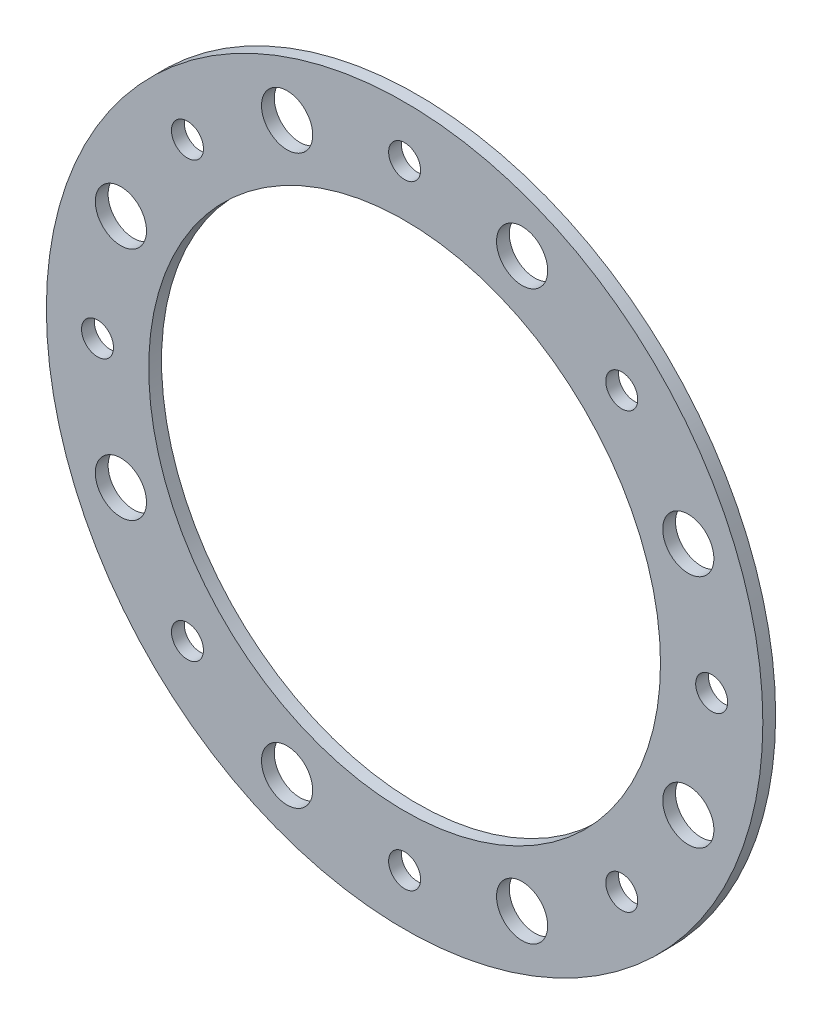
ISO-10303-21;
HEADER;
FILE_DESCRIPTION(('STEP AP214'),'2;1');
FILE_NAME('part.step','',(''),(''),'','','');
FILE_SCHEMA(('AUTOMOTIVE_DESIGN { 1 0 10303 214 1 1 1 1 }'));
ENDSEC;
DATA;
#1=APPLICATION_CONTEXT('core data for automotive mechanical design processes');
#2=APPLICATION_PROTOCOL_DEFINITION('international standard','automotive_design',2000,#1);
#3=PRODUCT_CONTEXT('',#1,'mechanical');
#4=PRODUCT('Part','Part','',(#3));
#5=PRODUCT_RELATED_PRODUCT_CATEGORY('part','',(#4));
#6=PRODUCT_DEFINITION_FORMATION('','',#4);
#7=PRODUCT_DEFINITION_CONTEXT('part definition',#1,'design');
#8=PRODUCT_DEFINITION('design','',#6,#7);
#9=PRODUCT_DEFINITION_SHAPE('','',#8);
#10=(LENGTH_UNIT() NAMED_UNIT(*) SI_UNIT(.MILLI.,.METRE.));
#11=(NAMED_UNIT(*) PLANE_ANGLE_UNIT() SI_UNIT($,.RADIAN.));
#12=(NAMED_UNIT(*) SI_UNIT($,.STERADIAN.) SOLID_ANGLE_UNIT());
#13=UNCERTAINTY_MEASURE_WITH_UNIT(LENGTH_MEASURE(1.E-05),#10,'distance_accuracy_value','');
#14=(GEOMETRIC_REPRESENTATION_CONTEXT(3) GLOBAL_UNCERTAINTY_ASSIGNED_CONTEXT((#13)) GLOBAL_UNIT_ASSIGNED_CONTEXT((#10,
#11,#12)) REPRESENTATION_CONTEXT('',''));
#15=CARTESIAN_POINT('',(0.,0.,0.));
#16=DIRECTION('',(0.,0.,1.));
#17=DIRECTION('',(1.,0.,0.));
#18=AXIS2_PLACEMENT_3D('',#15,#16,#17);
#19=CARTESIAN_POINT('',(0.,0.,1.));
#20=DIRECTION('',(0.,0.,1.));
#21=DIRECTION('',(1.,0.,0.));
#22=AXIS2_PLACEMENT_3D('',#19,#20,#21);
#23=PLANE('',#22);
#24=CARTESIAN_POINT('',(-9.18440237676203,22.1731087802709,1.));
#25=DIRECTION('',(0.,0.,1.));
#26=DIRECTION('',(1.,0.,0.));
#27=AXIS2_PLACEMENT_3D('',#24,#25,#26);
#28=CIRCLE('',#27,2.);
#29=CARTESIAN_POINT('',(-7.18440237676203,22.1731087802709,1.));
#30=VERTEX_POINT('',#29);
#31=EDGE_CURVE('E116',#30,#30,#28,.T.);
#32=ORIENTED_EDGE('',*,*,#31,.F.);
#33=EDGE_LOOP('',(#32));
#34=FACE_BOUND('',#33,.T.);
#35=CARTESIAN_POINT('',(-22.1731087802708,9.18440237676225,1.));
#36=DIRECTION('',(0.,0.,1.));
#37=DIRECTION('',(1.,0.,0.));
#38=AXIS2_PLACEMENT_3D('',#35,#36,#37);
#39=CIRCLE('',#38,2.);
#40=CARTESIAN_POINT('',(-20.1731087802708,9.18440237676225,1.));
#41=VERTEX_POINT('',#40);
#42=EDGE_CURVE('E106',#41,#41,#39,.T.);
#43=ORIENTED_EDGE('',*,*,#42,.F.);
#44=EDGE_LOOP('',(#43));
#45=FACE_BOUND('',#44,.T.);
#46=CARTESIAN_POINT('',(-22.1731087802709,-9.1844023767621,1.));
#47=DIRECTION('',(0.,0.,1.));
#48=DIRECTION('',(1.,0.,0.));
#49=AXIS2_PLACEMENT_3D('',#46,#47,#48);
#50=CIRCLE('',#49,2.);
#51=CARTESIAN_POINT('',(-20.1731087802709,-9.1844023767621,1.));
#52=VERTEX_POINT('',#51);
#53=EDGE_CURVE('E103',#52,#52,#50,.T.);
#54=ORIENTED_EDGE('',*,*,#53,.F.);
#55=EDGE_LOOP('',(#54));
#56=FACE_BOUND('',#55,.T.);
#57=CARTESIAN_POINT('',(-9.18440237676202,-22.1731087802709,1.));
#58=DIRECTION('',(0.,0.,1.));
#59=DIRECTION('',(1.,0.,0.));
#60=AXIS2_PLACEMENT_3D('',#57,#58,#59);
#61=CIRCLE('',#60,2.);
#62=CARTESIAN_POINT('',(-7.18440237676201,-22.1731087802709,1.));
#63=VERTEX_POINT('',#62);
#64=EDGE_CURVE('E100',#63,#63,#61,.T.);
#65=ORIENTED_EDGE('',*,*,#64,.F.);
#66=EDGE_LOOP('',(#65));
#67=FACE_BOUND('',#66,.T.);
#68=CARTESIAN_POINT('',(9.18440237676218,-22.1731087802709,1.));
#69=DIRECTION('',(0.,0.,1.));
#70=DIRECTION('',(1.,0.,0.));
#71=AXIS2_PLACEMENT_3D('',#68,#69,#70);
#72=CIRCLE('',#71,2.);
#73=CARTESIAN_POINT('',(11.1844023767622,-22.1731087802709,1.));
#74=VERTEX_POINT('',#73);
#75=EDGE_CURVE('E96',#74,#74,#72,.T.);
#76=ORIENTED_EDGE('',*,*,#75,.F.);
#77=EDGE_LOOP('',(#76));
#78=FACE_BOUND('',#77,.T.);
#79=CARTESIAN_POINT('',(22.1731087802709,-9.18440237676209,1.));
#80=DIRECTION('',(0.,0.,1.));
#81=DIRECTION('',(1.,0.,0.));
#82=AXIS2_PLACEMENT_3D('',#79,#80,#81);
#83=CIRCLE('',#82,2.);
#84=CARTESIAN_POINT('',(24.1731087802709,-9.18440237676209,1.));
#85=VERTEX_POINT('',#84);
#86=EDGE_CURVE('E92',#85,#85,#83,.T.);
#87=ORIENTED_EDGE('',*,*,#86,.F.);
#88=EDGE_LOOP('',(#87));
#89=FACE_BOUND('',#88,.T.);
#90=CARTESIAN_POINT('',(22.1731087802708,9.18440237676226,1.));
#91=DIRECTION('',(0.,0.,1.));
#92=DIRECTION('',(1.,0.,0.));
#93=AXIS2_PLACEMENT_3D('',#90,#91,#92);
#94=CIRCLE('',#93,2.);
#95=CARTESIAN_POINT('',(24.1731087802708,9.18440237676226,1.));
#96=VERTEX_POINT('',#95);
#97=EDGE_CURVE('E88',#96,#96,#94,.T.);
#98=ORIENTED_EDGE('',*,*,#97,.F.);
#99=EDGE_LOOP('',(#98));
#100=FACE_BOUND('',#99,.T.);
#101=CARTESIAN_POINT('',(9.18440237676202,22.1731087802709,1.));
#102=DIRECTION('',(0.,0.,1.));
#103=DIRECTION('',(1.,0.,0.));
#104=AXIS2_PLACEMENT_3D('',#101,#102,#103);
#105=CIRCLE('',#104,2.);
#106=CARTESIAN_POINT('',(11.184402376762,22.1731087802709,1.));
#107=VERTEX_POINT('',#106);
#108=EDGE_CURVE('E84',#107,#107,#105,.T.);
#109=ORIENTED_EDGE('',*,*,#108,.F.);
#110=EDGE_LOOP('',(#109));
#111=FACE_BOUND('',#110,.T.);
#112=CARTESIAN_POINT('',(-16.9705627484769,16.9705627484773,1.));
#113=DIRECTION('',(0.,0.,1.));
#114=DIRECTION('',(1.,0.,0.));
#115=AXIS2_PLACEMENT_3D('',#112,#113,#114);
#116=CIRCLE('',#115,1.24999999999999);
#117=CARTESIAN_POINT('',(-15.7205627484769,16.9705627484773,1.));
#118=VERTEX_POINT('',#117);
#119=EDGE_CURVE('E80',#118,#118,#116,.T.);
#120=ORIENTED_EDGE('',*,*,#119,.F.);
#121=EDGE_LOOP('',(#120));
#122=FACE_BOUND('',#121,.T.);
#123=CARTESIAN_POINT('',(-24.,2.51386656396706E-13,1.));
#124=DIRECTION('',(0.,0.,1.));
#125=DIRECTION('',(1.,0.,0.));
#126=AXIS2_PLACEMENT_3D('',#123,#124,#125);
#127=CIRCLE('',#126,1.24999999999999);
#128=CARTESIAN_POINT('',(-22.75,2.51386656396706E-13,1.));
#129=VERTEX_POINT('',#128);
#130=EDGE_CURVE('E76',#129,#129,#127,.T.);
#131=ORIENTED_EDGE('',*,*,#130,.F.);
#132=EDGE_LOOP('',(#131));
#133=FACE_BOUND('',#132,.T.);
#134=CARTESIAN_POINT('',(-16.9705627484773,-16.970562748477,1.));
#135=DIRECTION('',(0.,0.,1.));
#136=DIRECTION('',(1.,0.,0.));
#137=AXIS2_PLACEMENT_3D('',#134,#135,#136);
#138=CIRCLE('',#137,1.24999999999999);
#139=CARTESIAN_POINT('',(-15.7205627484773,-16.970562748477,1.));
#140=VERTEX_POINT('',#139);
#141=EDGE_CURVE('E72',#140,#140,#138,.T.);
#142=ORIENTED_EDGE('',*,*,#141,.F.);
#143=EDGE_LOOP('',(#142));
#144=FACE_BOUND('',#143,.T.);
#145=CARTESIAN_POINT('',(0.,-24.,1.));
#146=DIRECTION('',(0.,0.,1.));
#147=DIRECTION('',(1.,0.,0.));
#148=AXIS2_PLACEMENT_3D('',#145,#146,#147);
#149=CIRCLE('',#148,1.24999999999999);
#150=CARTESIAN_POINT('',(1.24999999999999,-24.,1.));
#151=VERTEX_POINT('',#150);
#152=EDGE_CURVE('E68',#151,#151,#149,.T.);
#153=ORIENTED_EDGE('',*,*,#152,.F.);
#154=EDGE_LOOP('',(#153));
#155=FACE_BOUND('',#154,.T.);
#156=CARTESIAN_POINT('',(16.9705627484771,-16.9705627484772,1.));
#157=DIRECTION('',(0.,0.,1.));
#158=DIRECTION('',(1.,0.,0.));
#159=AXIS2_PLACEMENT_3D('',#156,#157,#158);
#160=CIRCLE('',#159,1.24999999999999);
#161=CARTESIAN_POINT('',(18.220562748477,-16.9705627484772,1.));
#162=VERTEX_POINT('',#161);
#163=EDGE_CURVE('E64',#162,#162,#160,.T.);
#164=ORIENTED_EDGE('',*,*,#163,.F.);
#165=EDGE_LOOP('',(#164));
#166=FACE_BOUND('',#165,.T.);
#167=CARTESIAN_POINT('',(24.,0.,1.));
#168=DIRECTION('',(0.,0.,1.));
#169=DIRECTION('',(1.,0.,0.));
#170=AXIS2_PLACEMENT_3D('',#167,#168,#169);
#171=CIRCLE('',#170,1.24999999999999);
#172=CARTESIAN_POINT('',(25.25,0.,1.));
#173=VERTEX_POINT('',#172);
#174=EDGE_CURVE('E60',#173,#173,#171,.T.);
#175=ORIENTED_EDGE('',*,*,#174,.F.);
#176=EDGE_LOOP('',(#175));
#177=FACE_BOUND('',#176,.T.);
#178=CARTESIAN_POINT('',(16.9705627484772,16.9705627484771,1.));
#179=DIRECTION('',(0.,0.,1.));
#180=DIRECTION('',(1.,0.,0.));
#181=AXIS2_PLACEMENT_3D('',#178,#179,#180);
#182=CIRCLE('',#181,1.24999999999999);
#183=CARTESIAN_POINT('',(18.2205627484772,16.9705627484771,1.));
#184=VERTEX_POINT('',#183);
#185=EDGE_CURVE('E56',#184,#184,#182,.T.);
#186=ORIENTED_EDGE('',*,*,#185,.F.);
#187=EDGE_LOOP('',(#186));
#188=FACE_BOUND('',#187,.T.);
#189=CARTESIAN_POINT('',(0.,24.,1.));
#190=DIRECTION('',(0.,0.,1.));
#191=DIRECTION('',(1.,0.,0.));
#192=AXIS2_PLACEMENT_3D('',#189,#190,#191);
#193=CIRCLE('',#192,1.24999999999999);
#194=CARTESIAN_POINT('',(1.24999999999999,24.,1.));
#195=VERTEX_POINT('',#194);
#196=EDGE_CURVE('E52',#195,#195,#193,.T.);
#197=ORIENTED_EDGE('',*,*,#196,.F.);
#198=EDGE_LOOP('',(#197));
#199=FACE_BOUND('',#198,.T.);
#200=CARTESIAN_POINT('',(0.,0.,1.));
#201=DIRECTION('',(0.,0.,1.));
#202=DIRECTION('',(1.,0.,0.));
#203=AXIS2_PLACEMENT_3D('',#200,#201,#202);
#204=CIRCLE('',#203,28.);
#205=CARTESIAN_POINT('',(28.,0.,1.));
#206=VERTEX_POINT('',#205);
#207=EDGE_CURVE('E10',#206,#206,#204,.T.);
#208=ORIENTED_EDGE('',*,*,#207,.T.);
#209=EDGE_LOOP('',(#208));
#210=FACE_BOUND('',#209,.T.);
#211=CARTESIAN_POINT('',(0.,0.,1.));
#212=DIRECTION('',(0.,0.,1.));
#213=DIRECTION('',(1.,0.,0.));
#214=AXIS2_PLACEMENT_3D('',#211,#212,#213);
#215=CIRCLE('',#214,20.);
#216=CARTESIAN_POINT('',(20.,0.,1.));
#217=VERTEX_POINT('',#216);
#218=EDGE_CURVE('E43',#217,#217,#215,.T.);
#219=ORIENTED_EDGE('',*,*,#218,.F.);
#220=EDGE_LOOP('',(#219));
#221=FACE_BOUND('',#220,.T.);
#222=ADVANCED_FACE('F30',(#34,#45,#56,#67,#78,#89,#100,#111,#122,#133,#144,#155,#166,#177,#188,
#199,#210,#221),#23,.T.);
#223=CARTESIAN_POINT('',(0.,0.,0.));
#224=DIRECTION('',(0.,0.,1.));
#225=DIRECTION('',(1.,0.,0.));
#226=AXIS2_PLACEMENT_3D('',#223,#224,#225);
#227=PLANE('',#226);
#228=CARTESIAN_POINT('',(-9.18440237676203,22.1731087802709,0.));
#229=DIRECTION('',(0.,0.,1.));
#230=DIRECTION('',(1.,0.,0.));
#231=AXIS2_PLACEMENT_3D('',#228,#229,#230);
#232=CIRCLE('',#231,2.);
#233=CARTESIAN_POINT('',(-7.18440237676203,22.1731087802709,0.));
#234=VERTEX_POINT('',#233);
#235=EDGE_CURVE('E34',#234,#234,#232,.T.);
#236=ORIENTED_EDGE('',*,*,#235,.T.);
#237=EDGE_LOOP('',(#236));
#238=FACE_BOUND('',#237,.T.);
#239=CARTESIAN_POINT('',(-22.1731087802708,9.18440237676225,0.));
#240=DIRECTION('',(0.,0.,1.));
#241=DIRECTION('',(1.,0.,0.));
#242=AXIS2_PLACEMENT_3D('',#239,#240,#241);
#243=CIRCLE('',#242,2.);
#244=CARTESIAN_POINT('',(-20.1731087802708,9.18440237676225,0.));
#245=VERTEX_POINT('',#244);
#246=EDGE_CURVE('E104',#245,#245,#243,.T.);
#247=ORIENTED_EDGE('',*,*,#246,.T.);
#248=EDGE_LOOP('',(#247));
#249=FACE_BOUND('',#248,.T.);
#250=CARTESIAN_POINT('',(-22.1731087802709,-9.1844023767621,0.));
#251=DIRECTION('',(0.,0.,1.));
#252=DIRECTION('',(1.,0.,0.));
#253=AXIS2_PLACEMENT_3D('',#250,#251,#252);
#254=CIRCLE('',#253,2.);
#255=CARTESIAN_POINT('',(-20.1731087802709,-9.1844023767621,0.));
#256=VERTEX_POINT('',#255);
#257=EDGE_CURVE('E101',#256,#256,#254,.T.);
#258=ORIENTED_EDGE('',*,*,#257,.T.);
#259=EDGE_LOOP('',(#258));
#260=FACE_BOUND('',#259,.T.);
#261=CARTESIAN_POINT('',(-9.18440237676202,-22.1731087802709,0.));
#262=DIRECTION('',(0.,0.,1.));
#263=DIRECTION('',(1.,0.,0.));
#264=AXIS2_PLACEMENT_3D('',#261,#262,#263);
#265=CIRCLE('',#264,2.);
#266=CARTESIAN_POINT('',(-7.18440237676201,-22.1731087802709,0.));
#267=VERTEX_POINT('',#266);
#268=EDGE_CURVE('E97',#267,#267,#265,.T.);
#269=ORIENTED_EDGE('',*,*,#268,.T.);
#270=EDGE_LOOP('',(#269));
#271=FACE_BOUND('',#270,.T.);
#272=CARTESIAN_POINT('',(9.18440237676218,-22.1731087802709,0.));
#273=DIRECTION('',(0.,0.,1.));
#274=DIRECTION('',(1.,0.,0.));
#275=AXIS2_PLACEMENT_3D('',#272,#273,#274);
#276=CIRCLE('',#275,2.);
#277=CARTESIAN_POINT('',(11.1844023767622,-22.1731087802709,0.));
#278=VERTEX_POINT('',#277);
#279=EDGE_CURVE('E93',#278,#278,#276,.T.);
#280=ORIENTED_EDGE('',*,*,#279,.T.);
#281=EDGE_LOOP('',(#280));
#282=FACE_BOUND('',#281,.T.);
#283=CARTESIAN_POINT('',(22.1731087802709,-9.18440237676209,0.));
#284=DIRECTION('',(0.,0.,1.));
#285=DIRECTION('',(1.,0.,0.));
#286=AXIS2_PLACEMENT_3D('',#283,#284,#285);
#287=CIRCLE('',#286,2.);
#288=CARTESIAN_POINT('',(24.1731087802709,-9.18440237676209,0.));
#289=VERTEX_POINT('',#288);
#290=EDGE_CURVE('E89',#289,#289,#287,.T.);
#291=ORIENTED_EDGE('',*,*,#290,.T.);
#292=EDGE_LOOP('',(#291));
#293=FACE_BOUND('',#292,.T.);
#294=CARTESIAN_POINT('',(22.1731087802708,9.18440237676226,0.));
#295=DIRECTION('',(0.,0.,1.));
#296=DIRECTION('',(1.,0.,0.));
#297=AXIS2_PLACEMENT_3D('',#294,#295,#296);
#298=CIRCLE('',#297,2.);
#299=CARTESIAN_POINT('',(24.1731087802708,9.18440237676226,0.));
#300=VERTEX_POINT('',#299);
#301=EDGE_CURVE('E85',#300,#300,#298,.T.);
#302=ORIENTED_EDGE('',*,*,#301,.T.);
#303=EDGE_LOOP('',(#302));
#304=FACE_BOUND('',#303,.T.);
#305=CARTESIAN_POINT('',(9.18440237676202,22.1731087802709,0.));
#306=DIRECTION('',(0.,0.,1.));
#307=DIRECTION('',(1.,0.,0.));
#308=AXIS2_PLACEMENT_3D('',#305,#306,#307);
#309=CIRCLE('',#308,2.);
#310=CARTESIAN_POINT('',(11.184402376762,22.1731087802709,0.));
#311=VERTEX_POINT('',#310);
#312=EDGE_CURVE('E81',#311,#311,#309,.T.);
#313=ORIENTED_EDGE('',*,*,#312,.T.);
#314=EDGE_LOOP('',(#313));
#315=FACE_BOUND('',#314,.T.);
#316=CARTESIAN_POINT('',(-16.9705627484769,16.9705627484773,0.));
#317=DIRECTION('',(0.,0.,1.));
#318=DIRECTION('',(1.,0.,0.));
#319=AXIS2_PLACEMENT_3D('',#316,#317,#318);
#320=CIRCLE('',#319,1.24999999999999);
#321=CARTESIAN_POINT('',(-15.7205627484769,16.9705627484773,0.));
#322=VERTEX_POINT('',#321);
#323=EDGE_CURVE('E77',#322,#322,#320,.T.);
#324=ORIENTED_EDGE('',*,*,#323,.T.);
#325=EDGE_LOOP('',(#324));
#326=FACE_BOUND('',#325,.T.);
#327=CARTESIAN_POINT('',(-24.,2.51386656396706E-13,0.));
#328=DIRECTION('',(0.,0.,1.));
#329=DIRECTION('',(1.,0.,0.));
#330=AXIS2_PLACEMENT_3D('',#327,#328,#329);
#331=CIRCLE('',#330,1.24999999999999);
#332=CARTESIAN_POINT('',(-22.75,2.51386656396706E-13,0.));
#333=VERTEX_POINT('',#332);
#334=EDGE_CURVE('E73',#333,#333,#331,.T.);
#335=ORIENTED_EDGE('',*,*,#334,.T.);
#336=EDGE_LOOP('',(#335));
#337=FACE_BOUND('',#336,.T.);
#338=CARTESIAN_POINT('',(-16.9705627484773,-16.970562748477,0.));
#339=DIRECTION('',(0.,0.,1.));
#340=DIRECTION('',(1.,0.,0.));
#341=AXIS2_PLACEMENT_3D('',#338,#339,#340);
#342=CIRCLE('',#341,1.24999999999999);
#343=CARTESIAN_POINT('',(-15.7205627484773,-16.970562748477,0.));
#344=VERTEX_POINT('',#343);
#345=EDGE_CURVE('E69',#344,#344,#342,.T.);
#346=ORIENTED_EDGE('',*,*,#345,.T.);
#347=EDGE_LOOP('',(#346));
#348=FACE_BOUND('',#347,.T.);
#349=CARTESIAN_POINT('',(0.,-24.,0.));
#350=DIRECTION('',(0.,0.,1.));
#351=DIRECTION('',(1.,0.,0.));
#352=AXIS2_PLACEMENT_3D('',#349,#350,#351);
#353=CIRCLE('',#352,1.24999999999999);
#354=CARTESIAN_POINT('',(1.24999999999999,-24.,0.));
#355=VERTEX_POINT('',#354);
#356=EDGE_CURVE('E65',#355,#355,#353,.T.);
#357=ORIENTED_EDGE('',*,*,#356,.T.);
#358=EDGE_LOOP('',(#357));
#359=FACE_BOUND('',#358,.T.);
#360=CARTESIAN_POINT('',(16.9705627484771,-16.9705627484772,0.));
#361=DIRECTION('',(0.,0.,1.));
#362=DIRECTION('',(1.,0.,0.));
#363=AXIS2_PLACEMENT_3D('',#360,#361,#362);
#364=CIRCLE('',#363,1.24999999999999);
#365=CARTESIAN_POINT('',(18.220562748477,-16.9705627484772,0.));
#366=VERTEX_POINT('',#365);
#367=EDGE_CURVE('E61',#366,#366,#364,.T.);
#368=ORIENTED_EDGE('',*,*,#367,.T.);
#369=EDGE_LOOP('',(#368));
#370=FACE_BOUND('',#369,.T.);
#371=CARTESIAN_POINT('',(24.,0.,0.));
#372=DIRECTION('',(0.,0.,1.));
#373=DIRECTION('',(1.,0.,0.));
#374=AXIS2_PLACEMENT_3D('',#371,#372,#373);
#375=CIRCLE('',#374,1.24999999999999);
#376=CARTESIAN_POINT('',(25.25,0.,0.));
#377=VERTEX_POINT('',#376);
#378=EDGE_CURVE('E57',#377,#377,#375,.T.);
#379=ORIENTED_EDGE('',*,*,#378,.T.);
#380=EDGE_LOOP('',(#379));
#381=FACE_BOUND('',#380,.T.);
#382=CARTESIAN_POINT('',(16.9705627484772,16.9705627484771,0.));
#383=DIRECTION('',(0.,0.,1.));
#384=DIRECTION('',(1.,0.,0.));
#385=AXIS2_PLACEMENT_3D('',#382,#383,#384);
#386=CIRCLE('',#385,1.24999999999999);
#387=CARTESIAN_POINT('',(18.2205627484772,16.9705627484771,0.));
#388=VERTEX_POINT('',#387);
#389=EDGE_CURVE('E53',#388,#388,#386,.T.);
#390=ORIENTED_EDGE('',*,*,#389,.T.);
#391=EDGE_LOOP('',(#390));
#392=FACE_BOUND('',#391,.T.);
#393=CARTESIAN_POINT('',(0.,24.,0.));
#394=DIRECTION('',(0.,0.,1.));
#395=DIRECTION('',(1.,0.,0.));
#396=AXIS2_PLACEMENT_3D('',#393,#394,#395);
#397=CIRCLE('',#396,1.24999999999999);
#398=CARTESIAN_POINT('',(1.24999999999999,24.,0.));
#399=VERTEX_POINT('',#398);
#400=EDGE_CURVE('E49',#399,#399,#397,.T.);
#401=ORIENTED_EDGE('',*,*,#400,.T.);
#402=EDGE_LOOP('',(#401));
#403=FACE_BOUND('',#402,.T.);
#404=CARTESIAN_POINT('',(0.,0.,0.));
#405=DIRECTION('',(0.,0.,1.));
#406=DIRECTION('',(1.,0.,0.));
#407=AXIS2_PLACEMENT_3D('',#404,#405,#406);
#408=CIRCLE('',#407,28.);
#409=CARTESIAN_POINT('',(28.,0.,0.));
#410=VERTEX_POINT('',#409);
#411=EDGE_CURVE('E38',#410,#410,#408,.T.);
#412=ORIENTED_EDGE('',*,*,#411,.F.);
#413=EDGE_LOOP('',(#412));
#414=FACE_BOUND('',#413,.T.);
#415=CARTESIAN_POINT('',(0.,0.,0.));
#416=DIRECTION('',(0.,0.,1.));
#417=DIRECTION('',(1.,0.,0.));
#418=AXIS2_PLACEMENT_3D('',#415,#416,#417);
#419=CIRCLE('',#418,20.);
#420=CARTESIAN_POINT('',(20.,0.,0.));
#421=VERTEX_POINT('',#420);
#422=EDGE_CURVE('E46',#421,#421,#419,.T.);
#423=ORIENTED_EDGE('',*,*,#422,.T.);
#424=EDGE_LOOP('',(#423));
#425=FACE_BOUND('',#424,.T.);
#426=ADVANCED_FACE('F150',(#238,#249,#260,#271,#282,#293,#304,#315,#326,#337,#348,#359,#370,
#381,#392,#403,#414,#425),#227,.F.);
#427=CARTESIAN_POINT('',(0.,0.,1.));
#428=DIRECTION('',(0.,0.,-1.));
#429=DIRECTION('',(-1.,0.,0.));
#430=AXIS2_PLACEMENT_3D('',#427,#428,#429);
#431=CYLINDRICAL_SURFACE('',#430,28.);
#432=ORIENTED_EDGE('',*,*,#207,.F.);
#433=EDGE_LOOP('',(#432));
#434=FACE_BOUND('',#433,.T.);
#435=ORIENTED_EDGE('',*,*,#411,.T.);
#436=EDGE_LOOP('',(#435));
#437=FACE_BOUND('',#436,.T.);
#438=ADVANCED_FACE('F32',(#434,#437),#431,.T.);
#439=CARTESIAN_POINT('',(0.,0.,1.));
#440=DIRECTION('',(0.,0.,-1.));
#441=DIRECTION('',(-1.,0.,0.));
#442=AXIS2_PLACEMENT_3D('',#439,#440,#441);
#443=CYLINDRICAL_SURFACE('',#442,20.);
#444=ORIENTED_EDGE('',*,*,#218,.T.);
#445=EDGE_LOOP('',(#444));
#446=FACE_BOUND('',#445,.T.);
#447=ORIENTED_EDGE('',*,*,#422,.F.);
#448=EDGE_LOOP('',(#447));
#449=FACE_BOUND('',#448,.T.);
#450=ADVANCED_FACE('F152',(#446,#449),#443,.F.);
#451=CARTESIAN_POINT('',(0.,24.,1.));
#452=DIRECTION('',(0.,0.,1.));
#453=DIRECTION('',(1.,0.,0.));
#454=AXIS2_PLACEMENT_3D('',#451,#452,#453);
#455=CYLINDRICAL_SURFACE('',#454,1.24999999999999);
#456=ORIENTED_EDGE('',*,*,#196,.T.);
#457=EDGE_LOOP('',(#456));
#458=FACE_BOUND('',#457,.T.);
#459=ORIENTED_EDGE('',*,*,#400,.F.);
#460=EDGE_LOOP('',(#459));
#461=FACE_BOUND('',#460,.T.);
#462=ADVANCED_FACE('F154',(#458,#461),#455,.F.);
#463=CARTESIAN_POINT('',(16.9705627484772,16.9705627484771,1.));
#464=DIRECTION('',(0.,0.,1.));
#465=DIRECTION('',(1.,0.,0.));
#466=AXIS2_PLACEMENT_3D('',#463,#464,#465);
#467=CYLINDRICAL_SURFACE('',#466,1.24999999999999);
#468=ORIENTED_EDGE('',*,*,#185,.T.);
#469=EDGE_LOOP('',(#468));
#470=FACE_BOUND('',#469,.T.);
#471=ORIENTED_EDGE('',*,*,#389,.F.);
#472=EDGE_LOOP('',(#471));
#473=FACE_BOUND('',#472,.T.);
#474=ADVANCED_FACE('F160',(#470,#473),#467,.F.);
#475=CARTESIAN_POINT('',(24.,0.,1.));
#476=DIRECTION('',(0.,0.,1.));
#477=DIRECTION('',(1.,0.,0.));
#478=AXIS2_PLACEMENT_3D('',#475,#476,#477);
#479=CYLINDRICAL_SURFACE('',#478,1.24999999999999);
#480=ORIENTED_EDGE('',*,*,#174,.T.);
#481=EDGE_LOOP('',(#480));
#482=FACE_BOUND('',#481,.T.);
#483=ORIENTED_EDGE('',*,*,#378,.F.);
#484=EDGE_LOOP('',(#483));
#485=FACE_BOUND('',#484,.T.);
#486=ADVANCED_FACE('F212',(#482,#485),#479,.F.);
#487=CARTESIAN_POINT('',(16.9705627484771,-16.9705627484772,1.));
#488=DIRECTION('',(0.,0.,1.));
#489=DIRECTION('',(1.,0.,0.));
#490=AXIS2_PLACEMENT_3D('',#487,#488,#489);
#491=CYLINDRICAL_SURFACE('',#490,1.24999999999999);
#492=ORIENTED_EDGE('',*,*,#163,.T.);
#493=EDGE_LOOP('',(#492));
#494=FACE_BOUND('',#493,.T.);
#495=ORIENTED_EDGE('',*,*,#367,.F.);
#496=EDGE_LOOP('',(#495));
#497=FACE_BOUND('',#496,.T.);
#498=ADVANCED_FACE('F219',(#494,#497),#491,.F.);
#499=CARTESIAN_POINT('',(0.,-24.,1.));
#500=DIRECTION('',(0.,0.,1.));
#501=DIRECTION('',(1.,0.,0.));
#502=AXIS2_PLACEMENT_3D('',#499,#500,#501);
#503=CYLINDRICAL_SURFACE('',#502,1.24999999999999);
#504=ORIENTED_EDGE('',*,*,#152,.T.);
#505=EDGE_LOOP('',(#504));
#506=FACE_BOUND('',#505,.T.);
#507=ORIENTED_EDGE('',*,*,#356,.F.);
#508=EDGE_LOOP('',(#507));
#509=FACE_BOUND('',#508,.T.);
#510=ADVANCED_FACE('F225',(#506,#509),#503,.F.);
#511=CARTESIAN_POINT('',(-16.9705627484773,-16.970562748477,1.));
#512=DIRECTION('',(0.,0.,1.));
#513=DIRECTION('',(1.,0.,0.));
#514=AXIS2_PLACEMENT_3D('',#511,#512,#513);
#515=CYLINDRICAL_SURFACE('',#514,1.24999999999999);
#516=ORIENTED_EDGE('',*,*,#141,.T.);
#517=EDGE_LOOP('',(#516));
#518=FACE_BOUND('',#517,.T.);
#519=ORIENTED_EDGE('',*,*,#345,.F.);
#520=EDGE_LOOP('',(#519));
#521=FACE_BOUND('',#520,.T.);
#522=ADVANCED_FACE('F229',(#518,#521),#515,.F.);
#523=CARTESIAN_POINT('',(-24.,2.51386656396706E-13,1.));
#524=DIRECTION('',(0.,0.,1.));
#525=DIRECTION('',(1.,0.,0.));
#526=AXIS2_PLACEMENT_3D('',#523,#524,#525);
#527=CYLINDRICAL_SURFACE('',#526,1.24999999999999);
#528=ORIENTED_EDGE('',*,*,#130,.T.);
#529=EDGE_LOOP('',(#528));
#530=FACE_BOUND('',#529,.T.);
#531=ORIENTED_EDGE('',*,*,#334,.F.);
#532=EDGE_LOOP('',(#531));
#533=FACE_BOUND('',#532,.T.);
#534=ADVANCED_FACE('F233',(#530,#533),#527,.F.);
#535=CARTESIAN_POINT('',(-16.9705627484769,16.9705627484773,1.));
#536=DIRECTION('',(0.,0.,1.));
#537=DIRECTION('',(1.,0.,0.));
#538=AXIS2_PLACEMENT_3D('',#535,#536,#537);
#539=CYLINDRICAL_SURFACE('',#538,1.24999999999999);
#540=ORIENTED_EDGE('',*,*,#119,.T.);
#541=EDGE_LOOP('',(#540));
#542=FACE_BOUND('',#541,.T.);
#543=ORIENTED_EDGE('',*,*,#323,.F.);
#544=EDGE_LOOP('',(#543));
#545=FACE_BOUND('',#544,.T.);
#546=ADVANCED_FACE('F237',(#542,#545),#539,.F.);
#547=CARTESIAN_POINT('',(9.18440237676202,22.1731087802709,1.));
#548=DIRECTION('',(0.,0.,1.));
#549=DIRECTION('',(1.,0.,0.));
#550=AXIS2_PLACEMENT_3D('',#547,#548,#549);
#551=CYLINDRICAL_SURFACE('',#550,2.);
#552=ORIENTED_EDGE('',*,*,#108,.T.);
#553=EDGE_LOOP('',(#552));
#554=FACE_BOUND('',#553,.T.);
#555=ORIENTED_EDGE('',*,*,#312,.F.);
#556=EDGE_LOOP('',(#555));
#557=FACE_BOUND('',#556,.T.);
#558=ADVANCED_FACE('F241',(#554,#557),#551,.F.);
#559=CARTESIAN_POINT('',(22.1731087802708,9.18440237676226,1.));
#560=DIRECTION('',(0.,0.,1.));
#561=DIRECTION('',(1.,0.,0.));
#562=AXIS2_PLACEMENT_3D('',#559,#560,#561);
#563=CYLINDRICAL_SURFACE('',#562,2.);
#564=ORIENTED_EDGE('',*,*,#97,.T.);
#565=EDGE_LOOP('',(#564));
#566=FACE_BOUND('',#565,.T.);
#567=ORIENTED_EDGE('',*,*,#301,.F.);
#568=EDGE_LOOP('',(#567));
#569=FACE_BOUND('',#568,.T.);
#570=ADVANCED_FACE('F245',(#566,#569),#563,.F.);
#571=CARTESIAN_POINT('',(22.1731087802709,-9.18440237676209,1.));
#572=DIRECTION('',(0.,0.,1.));
#573=DIRECTION('',(1.,0.,0.));
#574=AXIS2_PLACEMENT_3D('',#571,#572,#573);
#575=CYLINDRICAL_SURFACE('',#574,2.);
#576=ORIENTED_EDGE('',*,*,#86,.T.);
#577=EDGE_LOOP('',(#576));
#578=FACE_BOUND('',#577,.T.);
#579=ORIENTED_EDGE('',*,*,#290,.F.);
#580=EDGE_LOOP('',(#579));
#581=FACE_BOUND('',#580,.T.);
#582=ADVANCED_FACE('F249',(#578,#581),#575,.F.);
#583=CARTESIAN_POINT('',(9.18440237676218,-22.1731087802709,1.));
#584=DIRECTION('',(0.,0.,1.));
#585=DIRECTION('',(1.,0.,0.));
#586=AXIS2_PLACEMENT_3D('',#583,#584,#585);
#587=CYLINDRICAL_SURFACE('',#586,2.);
#588=ORIENTED_EDGE('',*,*,#75,.T.);
#589=EDGE_LOOP('',(#588));
#590=FACE_BOUND('',#589,.T.);
#591=ORIENTED_EDGE('',*,*,#279,.F.);
#592=EDGE_LOOP('',(#591));
#593=FACE_BOUND('',#592,.T.);
#594=ADVANCED_FACE('F253',(#590,#593),#587,.F.);
#595=CARTESIAN_POINT('',(-9.18440237676202,-22.1731087802709,1.));
#596=DIRECTION('',(0.,0.,1.));
#597=DIRECTION('',(1.,0.,0.));
#598=AXIS2_PLACEMENT_3D('',#595,#596,#597);
#599=CYLINDRICAL_SURFACE('',#598,2.);
#600=ORIENTED_EDGE('',*,*,#64,.T.);
#601=EDGE_LOOP('',(#600));
#602=FACE_BOUND('',#601,.T.);
#603=ORIENTED_EDGE('',*,*,#268,.F.);
#604=EDGE_LOOP('',(#603));
#605=FACE_BOUND('',#604,.T.);
#606=ADVANCED_FACE('F257',(#602,#605),#599,.F.);
#607=CARTESIAN_POINT('',(-22.1731087802709,-9.1844023767621,1.));
#608=DIRECTION('',(0.,0.,1.));
#609=DIRECTION('',(1.,0.,0.));
#610=AXIS2_PLACEMENT_3D('',#607,#608,#609);
#611=CYLINDRICAL_SURFACE('',#610,2.);
#612=ORIENTED_EDGE('',*,*,#53,.T.);
#613=EDGE_LOOP('',(#612));
#614=FACE_BOUND('',#613,.T.);
#615=ORIENTED_EDGE('',*,*,#257,.F.);
#616=EDGE_LOOP('',(#615));
#617=FACE_BOUND('',#616,.T.);
#618=ADVANCED_FACE('F261',(#614,#617),#611,.F.);
#619=CARTESIAN_POINT('',(-22.1731087802708,9.18440237676225,1.));
#620=DIRECTION('',(0.,0.,1.));
#621=DIRECTION('',(1.,0.,0.));
#622=AXIS2_PLACEMENT_3D('',#619,#620,#621);
#623=CYLINDRICAL_SURFACE('',#622,2.);
#624=ORIENTED_EDGE('',*,*,#42,.T.);
#625=EDGE_LOOP('',(#624));
#626=FACE_BOUND('',#625,.T.);
#627=ORIENTED_EDGE('',*,*,#246,.F.);
#628=EDGE_LOOP('',(#627));
#629=FACE_BOUND('',#628,.T.);
#630=ADVANCED_FACE('F265',(#626,#629),#623,.F.);
#631=CARTESIAN_POINT('',(-9.18440237676203,22.1731087802709,1.));
#632=DIRECTION('',(0.,0.,1.));
#633=DIRECTION('',(1.,0.,0.));
#634=AXIS2_PLACEMENT_3D('',#631,#632,#633);
#635=CYLINDRICAL_SURFACE('',#634,2.);
#636=ORIENTED_EDGE('',*,*,#31,.T.);
#637=EDGE_LOOP('',(#636));
#638=FACE_BOUND('',#637,.T.);
#639=ORIENTED_EDGE('',*,*,#235,.F.);
#640=EDGE_LOOP('',(#639));
#641=FACE_BOUND('',#640,.T.);
#642=ADVANCED_FACE('F269',(#638,#641),#635,.F.);
#643=CLOSED_SHELL('',(#222,#426,#438,#450,#462,#474,#486,#498,#510,#522,#534,#546,#558,#570,
#582,#594,#606,#618,#630,#642));
#644=MANIFOLD_SOLID_BREP('B2',#643);
#645=ADVANCED_BREP_SHAPE_REPRESENTATION('',(#18,#644),#14);
#646=SHAPE_DEFINITION_REPRESENTATION(#9,#645);
ENDSEC;
END-ISO-10303-21;
